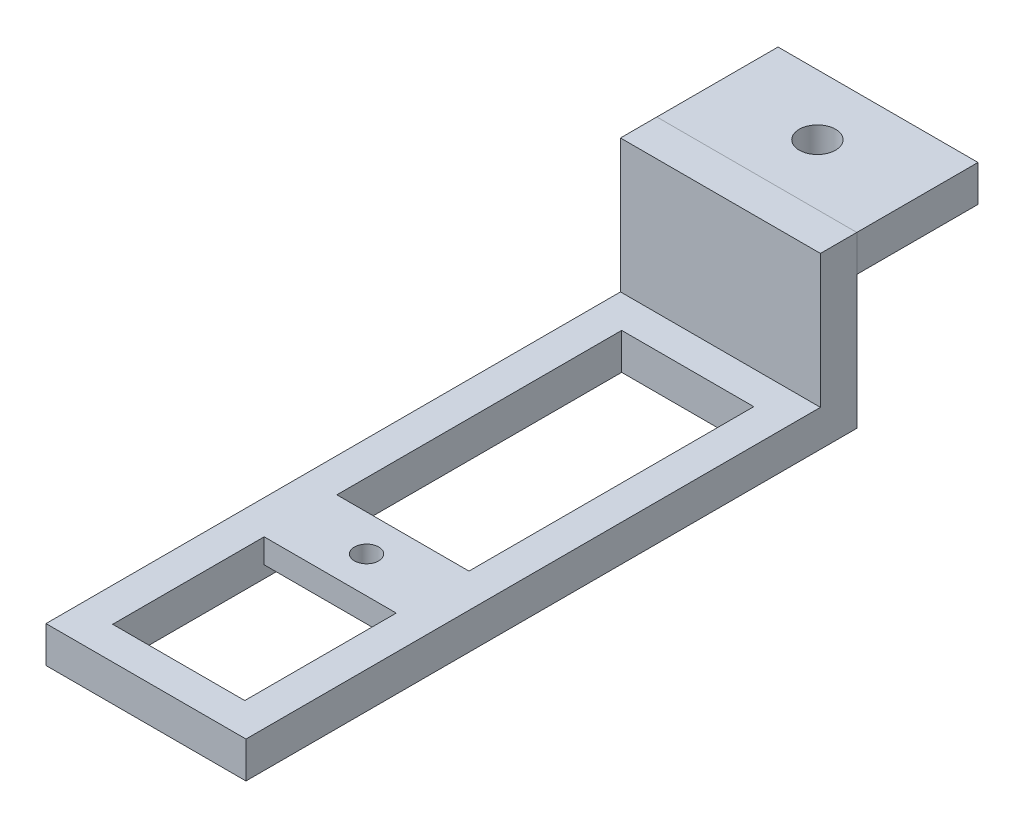
ISO-10303-21;
HEADER;
FILE_DESCRIPTION(('STEP AP214'),'2;1');
FILE_NAME('part.step','',(''),(''),'','','');
FILE_SCHEMA(('AUTOMOTIVE_DESIGN { 1 0 10303 214 1 1 1 1 }'));
ENDSEC;
DATA;
#1=APPLICATION_CONTEXT('core data for automotive mechanical design processes');
#2=APPLICATION_PROTOCOL_DEFINITION('international standard','automotive_design',2000,#1);
#3=PRODUCT_CONTEXT('',#1,'mechanical');
#4=PRODUCT('Part','Part','',(#3));
#5=PRODUCT_RELATED_PRODUCT_CATEGORY('part','',(#4));
#6=PRODUCT_DEFINITION_FORMATION('','',#4);
#7=PRODUCT_DEFINITION_CONTEXT('part definition',#1,'design');
#8=PRODUCT_DEFINITION('design','',#6,#7);
#9=PRODUCT_DEFINITION_SHAPE('','',#8);
#10=(LENGTH_UNIT() NAMED_UNIT(*) SI_UNIT(.MILLI.,.METRE.));
#11=(NAMED_UNIT(*) PLANE_ANGLE_UNIT() SI_UNIT($,.RADIAN.));
#12=(NAMED_UNIT(*) SI_UNIT($,.STERADIAN.) SOLID_ANGLE_UNIT());
#13=UNCERTAINTY_MEASURE_WITH_UNIT(LENGTH_MEASURE(1.E-05),#10,'distance_accuracy_value','');
#14=(GEOMETRIC_REPRESENTATION_CONTEXT(3) GLOBAL_UNCERTAINTY_ASSIGNED_CONTEXT((#13)) GLOBAL_UNIT_ASSIGNED_CONTEXT((#10,
#11,#12)) REPRESENTATION_CONTEXT('',''));
#15=CARTESIAN_POINT('',(0.,0.,0.));
#16=DIRECTION('',(0.,0.,1.));
#17=DIRECTION('',(1.,0.,0.));
#18=AXIS2_PLACEMENT_3D('',#15,#16,#17);
#19=CARTESIAN_POINT('',(8.49895383506108,-22.1577613516367,13.));
#20=DIRECTION('',(0.,0.,-1.));
#21=DIRECTION('',(-1.,0.,0.));
#22=AXIS2_PLACEMENT_3D('',#19,#20,#21);
#23=PLANE('',#22);
#24=DIRECTION('',(-1.,0.,0.));
#25=VECTOR('',#24,1.);
#26=CARTESIAN_POINT('',(-8.00104616493892,-19.1577613516367,13.));
#27=LINE('',#26,#25);
#28=CARTESIAN_POINT('',(8.49895383506108,-19.1577613516367,13.));
#29=VERTEX_POINT('',#28);
#30=CARTESIAN_POINT('',(-8.00104616493892,-19.1577613516367,13.));
#31=VERTEX_POINT('',#30);
#32=EDGE_CURVE('E209',#29,#31,#27,.T.);
#33=ORIENTED_EDGE('',*,*,#32,.F.);
#34=DIRECTION('',(0.,-1.,0.));
#35=VECTOR('',#34,1.);
#36=CARTESIAN_POINT('',(8.49895383506108,-22.1577613516367,13.));
#37=LINE('',#36,#35);
#38=CARTESIAN_POINT('',(8.49895383506108,-8.15776135163672,13.));
#39=VERTEX_POINT('',#38);
#40=EDGE_CURVE('E236',#39,#29,#37,.T.);
#41=ORIENTED_EDGE('',*,*,#40,.F.);
#42=DIRECTION('',(-1.,0.,0.));
#43=VECTOR('',#42,1.);
#44=CARTESIAN_POINT('',(8.49895383506108,-8.15776135163672,13.));
#45=LINE('',#44,#43);
#46=CARTESIAN_POINT('',(-8.00104616493892,-8.15776135163672,13.));
#47=VERTEX_POINT('',#46);
#48=EDGE_CURVE('E246',#39,#47,#45,.T.);
#49=ORIENTED_EDGE('',*,*,#48,.T.);
#50=DIRECTION('',(0.,-1.,0.));
#51=VECTOR('',#50,1.);
#52=CARTESIAN_POINT('',(-8.00104616493892,-22.1577613516367,13.));
#53=LINE('',#52,#51);
#54=EDGE_CURVE('E235',#47,#31,#53,.T.);
#55=ORIENTED_EDGE('',*,*,#54,.T.);
#56=EDGE_LOOP('',(#33,#41,#49,#55));
#57=FACE_BOUND('',#56,.T.);
#58=ADVANCED_FACE('F51',(#57),#23,.F.);
#59=CARTESIAN_POINT('',(8.49895383506108,-22.1577613516367,10.));
#60=DIRECTION('',(0.,1.,0.));
#61=DIRECTION('',(0.,0.,1.));
#62=AXIS2_PLACEMENT_3D('',#59,#60,#61);
#63=PLANE('',#62);
#64=DIRECTION('',(-1.,0.,0.));
#65=VECTOR('',#64,1.);
#66=CARTESIAN_POINT('',(5.69895383506108,-22.1577613516367,15.7));
#67=LINE('',#66,#65);
#68=CARTESIAN_POINT('',(5.69895383506108,-22.1577613516367,15.7));
#69=VERTEX_POINT('',#68);
#70=CARTESIAN_POINT('',(-5.20104616493892,-22.1577613516367,15.7));
#71=VERTEX_POINT('',#70);
#72=EDGE_CURVE('E197',#69,#71,#67,.T.);
#73=ORIENTED_EDGE('',*,*,#72,.T.);
#74=DIRECTION('',(0.,0.,1.));
#75=VECTOR('',#74,1.);
#76=CARTESIAN_POINT('',(-5.20104616493892,-22.1577613516367,57.7));
#77=LINE('',#76,#75);
#78=CARTESIAN_POINT('',(-5.20104616493892,-22.1577613516367,57.7));
#79=VERTEX_POINT('',#78);
#80=EDGE_CURVE('E187',#71,#79,#77,.T.);
#81=ORIENTED_EDGE('',*,*,#80,.T.);
#82=DIRECTION('',(1.,0.,0.));
#83=VECTOR('',#82,1.);
#84=CARTESIAN_POINT('',(5.69895383506108,-22.1577613516367,57.7));
#85=LINE('',#84,#83);
#86=CARTESIAN_POINT('',(5.69895383506108,-22.1577613516368,57.7));
#87=VERTEX_POINT('',#86);
#88=EDGE_CURVE('E190',#79,#87,#85,.T.);
#89=ORIENTED_EDGE('',*,*,#88,.T.);
#90=DIRECTION('',(0.,0.,-1.));
#91=VECTOR('',#90,1.);
#92=CARTESIAN_POINT('',(5.69895383506108,-22.1577613516367,57.7));
#93=LINE('',#92,#91);
#94=EDGE_CURVE('E194',#87,#69,#93,.T.);
#95=ORIENTED_EDGE('',*,*,#94,.T.);
#96=EDGE_LOOP('',(#73,#81,#89,#95));
#97=FACE_BOUND('',#96,.T.);
#98=DIRECTION('',(0.,0.,-1.));
#99=VECTOR('',#98,1.);
#100=CARTESIAN_POINT('',(-8.00104616493892,-22.1577613516367,10.));
#101=LINE('',#100,#99);
#102=CARTESIAN_POINT('',(-8.00104616493892,-22.1577613516367,60.4));
#103=VERTEX_POINT('',#102);
#104=CARTESIAN_POINT('',(-8.00104616493892,-22.1577613516367,10.));
#105=VERTEX_POINT('',#104);
#106=EDGE_CURVE('E248',#103,#105,#101,.T.);
#107=ORIENTED_EDGE('',*,*,#106,.T.);
#108=DIRECTION('',(-1.,0.,0.));
#109=VECTOR('',#108,1.);
#110=CARTESIAN_POINT('',(8.49895383506108,-22.1577613516367,10.));
#111=LINE('',#110,#109);
#112=CARTESIAN_POINT('',(8.49895383506108,-22.1577613516367,10.));
#113=VERTEX_POINT('',#112);
#114=EDGE_CURVE('E12',#113,#105,#111,.T.);
#115=ORIENTED_EDGE('',*,*,#114,.F.);
#116=DIRECTION('',(0.,0.,-1.));
#117=VECTOR('',#116,1.);
#118=CARTESIAN_POINT('',(8.49895383506108,-22.1577613516367,10.));
#119=LINE('',#118,#117);
#120=CARTESIAN_POINT('',(8.49895383506108,-22.1577613516367,60.4));
#121=VERTEX_POINT('',#120);
#122=EDGE_CURVE('E239',#121,#113,#119,.T.);
#123=ORIENTED_EDGE('',*,*,#122,.F.);
#124=DIRECTION('',(1.,0.,0.));
#125=VECTOR('',#124,1.);
#126=CARTESIAN_POINT('',(-8.00104616493892,-22.1577613516367,60.4));
#127=LINE('',#126,#125);
#128=EDGE_CURVE('E224',#103,#121,#127,.T.);
#129=ORIENTED_EDGE('',*,*,#128,.F.);
#130=EDGE_LOOP('',(#107,#115,#123,#129));
#131=FACE_BOUND('',#130,.T.);
#132=ADVANCED_FACE('F280',(#97,#131),#63,.F.);
#133=CARTESIAN_POINT('',(8.49895383506108,-22.1577613516367,10.));
#134=DIRECTION('',(0.,0.,1.));
#135=DIRECTION('',(1.,0.,0.));
#136=AXIS2_PLACEMENT_3D('',#133,#134,#135);
#137=PLANE('',#136);
#138=DIRECTION('',(0.,1.,0.));
#139=VECTOR('',#138,1.);
#140=CARTESIAN_POINT('',(-8.00104616493892,-22.1577613516367,10.));
#141=LINE('',#140,#139);
#142=CARTESIAN_POINT('',(-8.00104616493892,-8.15776135163671,10.));
#143=VERTEX_POINT('',#142);
#144=EDGE_CURVE('E250',#105,#143,#141,.T.);
#145=ORIENTED_EDGE('',*,*,#144,.T.);
#146=DIRECTION('',(-1.,0.,0.));
#147=VECTOR('',#146,1.);
#148=CARTESIAN_POINT('',(8.49895383506108,-8.15776135163671,10.));
#149=LINE('',#148,#147);
#150=CARTESIAN_POINT('',(8.49895383506108,-8.15776135163671,10.));
#151=VERTEX_POINT('',#150);
#152=EDGE_CURVE('E58',#151,#143,#149,.T.);
#153=ORIENTED_EDGE('',*,*,#152,.F.);
#154=DIRECTION('',(0.,1.,0.));
#155=VECTOR('',#154,1.);
#156=CARTESIAN_POINT('',(8.49895383506108,-22.1577613516367,10.));
#157=LINE('',#156,#155);
#158=EDGE_CURVE('E242',#113,#151,#157,.T.);
#159=ORIENTED_EDGE('',*,*,#158,.F.);
#160=ORIENTED_EDGE('',*,*,#114,.T.);
#161=EDGE_LOOP('',(#145,#153,#159,#160));
#162=FACE_BOUND('',#161,.T.);
#163=ADVANCED_FACE('F278',(#162),#137,.F.);
#164=CARTESIAN_POINT('',(8.49895383506108,-8.15776135163671,10.));
#165=DIRECTION('',(0.,-1.,0.));
#166=DIRECTION('',(0.,0.,-1.));
#167=AXIS2_PLACEMENT_3D('',#164,#165,#166);
#168=PLANE('',#167);
#169=DIRECTION('',(0.,0.,1.));
#170=VECTOR('',#169,1.);
#171=CARTESIAN_POINT('',(-8.00104616493892,-8.15776135163671,10.));
#172=LINE('',#171,#170);
#173=EDGE_CURVE('E240',#143,#47,#172,.T.);
#174=ORIENTED_EDGE('',*,*,#173,.T.);
#175=ORIENTED_EDGE('',*,*,#48,.F.);
#176=DIRECTION('',(0.,0.,1.));
#177=VECTOR('',#176,1.);
#178=CARTESIAN_POINT('',(8.49895383506108,-8.15776135163671,10.));
#179=LINE('',#178,#177);
#180=EDGE_CURVE('E244',#151,#39,#179,.T.);
#181=ORIENTED_EDGE('',*,*,#180,.F.);
#182=ORIENTED_EDGE('',*,*,#152,.T.);
#183=EDGE_LOOP('',(#174,#175,#181,#182));
#184=FACE_BOUND('',#183,.T.);
#185=ADVANCED_FACE('F259',(#184),#168,.F.);
#186=CARTESIAN_POINT('',(8.49895383506108,0.,0.));
#187=DIRECTION('',(1.,0.,0.));
#188=DIRECTION('',(0.,0.,-1.));
#189=AXIS2_PLACEMENT_3D('',#186,#187,#188);
#190=PLANE('',#189);
#191=ORIENTED_EDGE('',*,*,#40,.T.);
#192=DIRECTION('',(0.,0.,-1.));
#193=VECTOR('',#192,1.);
#194=CARTESIAN_POINT('',(8.49895383506108,-19.1577613516367,60.4));
#195=LINE('',#194,#193);
#196=CARTESIAN_POINT('',(8.49895383506108,-19.1577613516367,60.4));
#197=VERTEX_POINT('',#196);
#198=EDGE_CURVE('E232',#197,#29,#195,.T.);
#199=ORIENTED_EDGE('',*,*,#198,.F.);
#200=DIRECTION('',(0.,1.,0.));
#201=VECTOR('',#200,1.);
#202=CARTESIAN_POINT('',(8.49895383506108,-19.1577613516367,60.4));
#203=LINE('',#202,#201);
#204=EDGE_CURVE('E216',#121,#197,#203,.T.);
#205=ORIENTED_EDGE('',*,*,#204,.F.);
#206=ORIENTED_EDGE('',*,*,#122,.T.);
#207=ORIENTED_EDGE('',*,*,#158,.T.);
#208=ORIENTED_EDGE('',*,*,#180,.T.);
#209=EDGE_LOOP('',(#191,#199,#205,#206,#207,#208));
#210=FACE_BOUND('',#209,.T.);
#211=ADVANCED_FACE('F276',(#210),#190,.T.);
#212=CARTESIAN_POINT('',(-8.00104616493892,0.,0.));
#213=DIRECTION('',(1.,0.,0.));
#214=DIRECTION('',(0.,0.,-1.));
#215=AXIS2_PLACEMENT_3D('',#212,#213,#214);
#216=PLANE('',#215);
#217=ORIENTED_EDGE('',*,*,#54,.F.);
#218=ORIENTED_EDGE('',*,*,#173,.F.);
#219=ORIENTED_EDGE('',*,*,#144,.F.);
#220=ORIENTED_EDGE('',*,*,#106,.F.);
#221=DIRECTION('',(0.,-1.,0.));
#222=VECTOR('',#221,1.);
#223=CARTESIAN_POINT('',(-8.00104616493892,-19.1577613516367,60.4));
#224=LINE('',#223,#222);
#225=CARTESIAN_POINT('',(-8.00104616493892,-19.1577613516367,60.4));
#226=VERTEX_POINT('',#225);
#227=EDGE_CURVE('E221',#226,#103,#224,.T.);
#228=ORIENTED_EDGE('',*,*,#227,.F.);
#229=DIRECTION('',(0.,0.,-1.));
#230=VECTOR('',#229,1.);
#231=CARTESIAN_POINT('',(-8.00104616493892,-19.1577613516367,60.4));
#232=LINE('',#231,#230);
#233=EDGE_CURVE('E227',#226,#31,#232,.T.);
#234=ORIENTED_EDGE('',*,*,#233,.T.);
#235=EDGE_LOOP('',(#217,#218,#219,#220,#228,#234));
#236=FACE_BOUND('',#235,.T.);
#237=ADVANCED_FACE('F266',(#236),#216,.F.);
#238=CARTESIAN_POINT('',(-8.00104616493892,-19.1577613516367,60.4));
#239=DIRECTION('',(0.,-1.,0.));
#240=DIRECTION('',(0.,0.,-1.));
#241=AXIS2_PLACEMENT_3D('',#238,#239,#240);
#242=PLANE('',#241);
#243=DIRECTION('',(0.,0.,1.));
#244=VECTOR('',#243,1.);
#245=CARTESIAN_POINT('',(-5.20104616493892,-19.1577613516367,57.7));
#246=LINE('',#245,#244);
#247=CARTESIAN_POINT('',(-5.20104616493892,-19.1577613516367,45.2));
#248=VERTEX_POINT('',#247);
#249=CARTESIAN_POINT('',(-5.20104616493892,-19.1577613516367,57.7));
#250=VERTEX_POINT('',#249);
#251=EDGE_CURVE('E150',#248,#250,#246,.T.);
#252=ORIENTED_EDGE('',*,*,#251,.F.);
#253=DIRECTION('',(1.,0.,0.));
#254=VECTOR('',#253,1.);
#255=CARTESIAN_POINT('',(5.69895383506108,-19.1577613516367,45.2));
#256=LINE('',#255,#254);
#257=CARTESIAN_POINT('',(5.69895383506108,-19.1577613516367,45.2));
#258=VERTEX_POINT('',#257);
#259=EDGE_CURVE('E155',#248,#258,#256,.T.);
#260=ORIENTED_EDGE('',*,*,#259,.T.);
#261=DIRECTION('',(0.,0.,-1.));
#262=VECTOR('',#261,1.);
#263=CARTESIAN_POINT('',(5.69895383506108,-19.1577613516367,57.7));
#264=LINE('',#263,#262);
#265=CARTESIAN_POINT('',(5.69895383506108,-19.1577613516367,57.7));
#266=VERTEX_POINT('',#265);
#267=EDGE_CURVE('E203',#266,#258,#264,.T.);
#268=ORIENTED_EDGE('',*,*,#267,.F.);
#269=DIRECTION('',(1.,0.,0.));
#270=VECTOR('',#269,1.);
#271=CARTESIAN_POINT('',(5.69895383506108,-19.1577613516367,57.7));
#272=LINE('',#271,#270);
#273=EDGE_CURVE('E157',#250,#266,#272,.T.);
#274=ORIENTED_EDGE('',*,*,#273,.F.);
#275=EDGE_LOOP('',(#252,#260,#268,#274));
#276=FACE_BOUND('',#275,.T.);
#277=DIRECTION('',(-1.,0.,0.));
#278=VECTOR('',#277,1.);
#279=CARTESIAN_POINT('',(5.69895383506108,-19.1577613516367,39.2));
#280=LINE('',#279,#278);
#281=CARTESIAN_POINT('',(5.69895383506108,-19.1577613516367,39.2));
#282=VERTEX_POINT('',#281);
#283=CARTESIAN_POINT('',(-5.20104616493892,-19.1577613516367,39.2));
#284=VERTEX_POINT('',#283);
#285=EDGE_CURVE('E171',#282,#284,#280,.T.);
#286=ORIENTED_EDGE('',*,*,#285,.T.);
#287=CARTESIAN_POINT('',(-5.20104616493892,-19.1577613516367,15.7));
#288=VERTEX_POINT('',#287);
#289=EDGE_CURVE('E159',#288,#284,#246,.T.);
#290=ORIENTED_EDGE('',*,*,#289,.F.);
#291=DIRECTION('',(-1.,0.,0.));
#292=VECTOR('',#291,1.);
#293=CARTESIAN_POINT('',(5.69895383506108,-19.1577613516367,15.7));
#294=LINE('',#293,#292);
#295=CARTESIAN_POINT('',(5.69895383506108,-19.1577613516367,15.7));
#296=VERTEX_POINT('',#295);
#297=EDGE_CURVE('E191',#296,#288,#294,.T.);
#298=ORIENTED_EDGE('',*,*,#297,.F.);
#299=EDGE_CURVE('E202',#282,#296,#264,.T.);
#300=ORIENTED_EDGE('',*,*,#299,.F.);
#301=EDGE_LOOP('',(#286,#290,#298,#300));
#302=FACE_BOUND('',#301,.T.);
#303=ORIENTED_EDGE('',*,*,#32,.T.);
#304=ORIENTED_EDGE('',*,*,#233,.F.);
#305=DIRECTION('',(-1.,0.,0.));
#306=VECTOR('',#305,1.);
#307=CARTESIAN_POINT('',(-8.00104616493892,-19.1577613516367,60.4));
#308=LINE('',#307,#306);
#309=EDGE_CURVE('E219',#197,#226,#308,.T.);
#310=ORIENTED_EDGE('',*,*,#309,.F.);
#311=ORIENTED_EDGE('',*,*,#198,.T.);
#312=EDGE_LOOP('',(#303,#304,#310,#311));
#313=FACE_BOUND('',#312,.T.);
#314=CARTESIAN_POINT('',(0.248953835061079,-19.1577613516367,42.2));
#315=DIRECTION('',(0.,1.,0.));
#316=DIRECTION('',(0.,0.,1.));
#317=AXIS2_PLACEMENT_3D('',#314,#315,#316);
#318=CIRCLE('',#317,1.);
#319=CARTESIAN_POINT('',(0.248953835061079,-19.1577613516367,43.2));
#320=VERTEX_POINT('',#319);
#321=EDGE_CURVE('E177',#320,#320,#318,.T.);
#322=ORIENTED_EDGE('',*,*,#321,.F.);
#323=EDGE_LOOP('',(#322));
#324=FACE_BOUND('',#323,.T.);
#325=ADVANCED_FACE('F151',(#276,#302,#313,#324),#242,.F.);
#326=CARTESIAN_POINT('',(0.,0.,60.4));
#327=DIRECTION('',(0.,0.,1.));
#328=DIRECTION('',(1.,0.,0.));
#329=AXIS2_PLACEMENT_3D('',#326,#327,#328);
#330=PLANE('',#329);
#331=ORIENTED_EDGE('',*,*,#204,.T.);
#332=ORIENTED_EDGE('',*,*,#309,.T.);
#333=ORIENTED_EDGE('',*,*,#227,.T.);
#334=ORIENTED_EDGE('',*,*,#128,.T.);
#335=EDGE_LOOP('',(#331,#332,#333,#334));
#336=FACE_BOUND('',#335,.T.);
#337=ADVANCED_FACE('F283',(#336),#330,.T.);
#338=CARTESIAN_POINT('',(-5.20104616493892,-22.1577613516367,57.7));
#339=DIRECTION('',(-1.,0.,0.));
#340=DIRECTION('',(0.,0.,1.));
#341=AXIS2_PLACEMENT_3D('',#338,#339,#340);
#342=PLANE('',#341);
#343=ORIENTED_EDGE('',*,*,#289,.T.);
#344=DIRECTION('',(0.,1.,0.));
#345=VECTOR('',#344,1.);
#346=CARTESIAN_POINT('',(-5.20104616493892,-21.1577613516367,39.2));
#347=LINE('',#346,#345);
#348=CARTESIAN_POINT('',(-5.20104616493892,-21.1577613516367,39.2));
#349=VERTEX_POINT('',#348);
#350=EDGE_CURVE('E65',#349,#284,#347,.T.);
#351=ORIENTED_EDGE('',*,*,#350,.F.);
#352=DIRECTION('',(0.,0.,1.));
#353=VECTOR('',#352,1.);
#354=CARTESIAN_POINT('',(-5.20104616493892,-21.1577613516367,45.2));
#355=LINE('',#354,#353);
#356=CARTESIAN_POINT('',(-5.20104616493892,-21.1577613516367,45.2));
#357=VERTEX_POINT('',#356);
#358=EDGE_CURVE('E69',#349,#357,#355,.T.);
#359=ORIENTED_EDGE('',*,*,#358,.T.);
#360=DIRECTION('',(0.,1.,0.));
#361=VECTOR('',#360,1.);
#362=CARTESIAN_POINT('',(-5.20104616493892,-21.1577613516367,45.2));
#363=LINE('',#362,#361);
#364=EDGE_CURVE('E161',#357,#248,#363,.T.);
#365=ORIENTED_EDGE('',*,*,#364,.T.);
#366=ORIENTED_EDGE('',*,*,#251,.T.);
#367=DIRECTION('',(0.,1.,0.));
#368=VECTOR('',#367,1.);
#369=CARTESIAN_POINT('',(-5.20104616493892,-22.1577613516367,57.7));
#370=LINE('',#369,#368);
#371=EDGE_CURVE('E199',#79,#250,#370,.T.);
#372=ORIENTED_EDGE('',*,*,#371,.F.);
#373=ORIENTED_EDGE('',*,*,#80,.F.);
#374=DIRECTION('',(0.,1.,0.));
#375=VECTOR('',#374,1.);
#376=CARTESIAN_POINT('',(-5.20104616493892,-22.1577613516367,15.7));
#377=LINE('',#376,#375);
#378=EDGE_CURVE('E207',#71,#288,#377,.T.);
#379=ORIENTED_EDGE('',*,*,#378,.T.);
#380=EDGE_LOOP('',(#343,#351,#359,#365,#366,#372,#373,#379));
#381=FACE_BOUND('',#380,.T.);
#382=ADVANCED_FACE('F162',(#381),#342,.F.);
#383=CARTESIAN_POINT('',(5.69895383506108,-22.1577613516367,15.7));
#384=DIRECTION('',(0.,0.,-1.));
#385=DIRECTION('',(-1.,0.,0.));
#386=AXIS2_PLACEMENT_3D('',#383,#384,#385);
#387=PLANE('',#386);
#388=ORIENTED_EDGE('',*,*,#297,.T.);
#389=ORIENTED_EDGE('',*,*,#378,.F.);
#390=ORIENTED_EDGE('',*,*,#72,.F.);
#391=DIRECTION('',(0.,1.,0.));
#392=VECTOR('',#391,1.);
#393=CARTESIAN_POINT('',(5.69895383506108,-22.1577613516367,15.7));
#394=LINE('',#393,#392);
#395=EDGE_CURVE('E210',#69,#296,#394,.T.);
#396=ORIENTED_EDGE('',*,*,#395,.T.);
#397=EDGE_LOOP('',(#388,#389,#390,#396));
#398=FACE_BOUND('',#397,.T.);
#399=ADVANCED_FACE('F291',(#398),#387,.F.);
#400=CARTESIAN_POINT('',(5.69895383506108,-22.1577613516367,57.7));
#401=DIRECTION('',(1.,0.,0.));
#402=DIRECTION('',(0.,0.,-1.));
#403=AXIS2_PLACEMENT_3D('',#400,#401,#402);
#404=PLANE('',#403);
#405=DIRECTION('',(0.,0.,-1.));
#406=VECTOR('',#405,1.);
#407=CARTESIAN_POINT('',(5.69895383506108,-21.1577613516367,45.2));
#408=LINE('',#407,#406);
#409=CARTESIAN_POINT('',(5.69895383506108,-21.1577613516367,45.2));
#410=VERTEX_POINT('',#409);
#411=CARTESIAN_POINT('',(5.69895383506108,-21.1577613516367,39.2));
#412=VERTEX_POINT('',#411);
#413=EDGE_CURVE('E416',#410,#412,#408,.T.);
#414=ORIENTED_EDGE('',*,*,#413,.T.);
#415=DIRECTION('',(0.,1.,0.));
#416=VECTOR('',#415,1.);
#417=CARTESIAN_POINT('',(5.69895383506108,-21.1577613516367,39.2));
#418=LINE('',#417,#416);
#419=EDGE_CURVE('E183',#412,#282,#418,.T.);
#420=ORIENTED_EDGE('',*,*,#419,.T.);
#421=ORIENTED_EDGE('',*,*,#299,.T.);
#422=ORIENTED_EDGE('',*,*,#395,.F.);
#423=ORIENTED_EDGE('',*,*,#94,.F.);
#424=DIRECTION('',(0.,1.,0.));
#425=VECTOR('',#424,1.);
#426=CARTESIAN_POINT('',(5.69895383506108,-22.1577613516367,57.7));
#427=LINE('',#426,#425);
#428=EDGE_CURVE('E213',#87,#266,#427,.T.);
#429=ORIENTED_EDGE('',*,*,#428,.T.);
#430=ORIENTED_EDGE('',*,*,#267,.T.);
#431=DIRECTION('',(0.,1.,0.));
#432=VECTOR('',#431,1.);
#433=CARTESIAN_POINT('',(5.69895383506108,-21.1577613516367,45.2));
#434=LINE('',#433,#432);
#435=EDGE_CURVE('E166',#410,#258,#434,.T.);
#436=ORIENTED_EDGE('',*,*,#435,.F.);
#437=EDGE_LOOP('',(#414,#420,#421,#422,#423,#429,#430,#436));
#438=FACE_BOUND('',#437,.T.);
#439=ADVANCED_FACE('F349',(#438),#404,.F.);
#440=CARTESIAN_POINT('',(5.69895383506108,-22.1577613516367,57.7));
#441=DIRECTION('',(0.,0.,1.));
#442=DIRECTION('',(1.,0.,0.));
#443=AXIS2_PLACEMENT_3D('',#440,#441,#442);
#444=PLANE('',#443);
#445=ORIENTED_EDGE('',*,*,#273,.T.);
#446=ORIENTED_EDGE('',*,*,#428,.F.);
#447=ORIENTED_EDGE('',*,*,#88,.F.);
#448=ORIENTED_EDGE('',*,*,#371,.T.);
#449=EDGE_LOOP('',(#445,#446,#447,#448));
#450=FACE_BOUND('',#449,.T.);
#451=ADVANCED_FACE('F358',(#450),#444,.F.);
#452=CARTESIAN_POINT('',(5.69895383506108,-21.1577613516367,39.2));
#453=DIRECTION('',(0.,0.,-1.));
#454=DIRECTION('',(-1.,0.,0.));
#455=AXIS2_PLACEMENT_3D('',#452,#453,#454);
#456=PLANE('',#455);
#457=ORIENTED_EDGE('',*,*,#285,.F.);
#458=ORIENTED_EDGE('',*,*,#419,.F.);
#459=DIRECTION('',(-1.,0.,0.));
#460=VECTOR('',#459,1.);
#461=CARTESIAN_POINT('',(5.69895383506108,-21.1577613516367,39.2));
#462=LINE('',#461,#460);
#463=EDGE_CURVE('E167',#412,#349,#462,.T.);
#464=ORIENTED_EDGE('',*,*,#463,.T.);
#465=ORIENTED_EDGE('',*,*,#350,.T.);
#466=EDGE_LOOP('',(#457,#458,#464,#465));
#467=FACE_BOUND('',#466,.T.);
#468=ADVANCED_FACE('F367',(#467),#456,.T.);
#469=CARTESIAN_POINT('',(5.69895383506108,-21.1577613516367,45.2));
#470=DIRECTION('',(0.,0.,1.));
#471=DIRECTION('',(1.,0.,0.));
#472=AXIS2_PLACEMENT_3D('',#469,#470,#471);
#473=PLANE('',#472);
#474=ORIENTED_EDGE('',*,*,#259,.F.);
#475=ORIENTED_EDGE('',*,*,#364,.F.);
#476=DIRECTION('',(1.,0.,0.));
#477=VECTOR('',#476,1.);
#478=CARTESIAN_POINT('',(5.69895383506108,-21.1577613516367,45.2));
#479=LINE('',#478,#477);
#480=EDGE_CURVE('E415',#357,#410,#479,.T.);
#481=ORIENTED_EDGE('',*,*,#480,.T.);
#482=ORIENTED_EDGE('',*,*,#435,.T.);
#483=EDGE_LOOP('',(#474,#475,#481,#482));
#484=FACE_BOUND('',#483,.T.);
#485=ADVANCED_FACE('F170',(#484),#473,.T.);
#486=CARTESIAN_POINT('',(0.,-21.1577613516367,0.));
#487=DIRECTION('',(0.,1.,0.));
#488=DIRECTION('',(0.,0.,1.));
#489=AXIS2_PLACEMENT_3D('',#486,#487,#488);
#490=PLANE('',#489);
#491=CARTESIAN_POINT('',(0.248953835061079,-21.1577613516367,42.2));
#492=DIRECTION('',(0.,1.,0.));
#493=DIRECTION('',(0.,0.,1.));
#494=AXIS2_PLACEMENT_3D('',#491,#492,#493);
#495=CIRCLE('',#494,1.);
#496=CARTESIAN_POINT('',(0.248953835061079,-21.1577613516367,43.2));
#497=VERTEX_POINT('',#496);
#498=EDGE_CURVE('E172',#497,#497,#495,.T.);
#499=ORIENTED_EDGE('',*,*,#498,.T.);
#500=EDGE_LOOP('',(#499));
#501=FACE_BOUND('',#500,.T.);
#502=ORIENTED_EDGE('',*,*,#358,.F.);
#503=ORIENTED_EDGE('',*,*,#463,.F.);
#504=ORIENTED_EDGE('',*,*,#413,.F.);
#505=ORIENTED_EDGE('',*,*,#480,.F.);
#506=EDGE_LOOP('',(#502,#503,#504,#505));
#507=FACE_BOUND('',#506,.T.);
#508=ADVANCED_FACE('F384',(#501,#507),#490,.F.);
#509=CARTESIAN_POINT('',(0.248953835061079,-21.1577613516367,42.2));
#510=DIRECTION('',(0.,1.,0.));
#511=DIRECTION('',(0.,0.,1.));
#512=AXIS2_PLACEMENT_3D('',#509,#510,#511);
#513=CYLINDRICAL_SURFACE('',#512,1.);
#514=ORIENTED_EDGE('',*,*,#498,.F.);
#515=EDGE_LOOP('',(#514));
#516=FACE_BOUND('',#515,.T.);
#517=ORIENTED_EDGE('',*,*,#321,.T.);
#518=EDGE_LOOP('',(#517));
#519=FACE_BOUND('',#518,.T.);
#520=ADVANCED_FACE('F392',(#516,#519),#513,.F.);
#521=CLOSED_SHELL('',(#58,#132,#163,#185,#211,#237,#325,#337,#382,#399,#439,#451,#468,#485,#508,#520));
#522=MANIFOLD_SOLID_BREP('B2',#521);
#523=CARTESIAN_POINT('',(-8.00104616493892,-28.6577613516367,15.1627971778015));
#524=DIRECTION('',(1.,0.,0.));
#525=DIRECTION('',(0.,1.,0.));
#526=AXIS2_PLACEMENT_3D('',#523,#524,#525);
#527=PLANE('',#526);
#528=DIRECTION('',(0.,1.,0.));
#529=VECTOR('',#528,1.);
#530=CARTESIAN_POINT('',(-8.00104616493892,0.,10.));
#531=LINE('',#530,#529);
#532=CARTESIAN_POINT('',(-8.00104616493892,-11.1577613516367,10.));
#533=VERTEX_POINT('',#532);
#534=CARTESIAN_POINT('',(-8.00104616493892,-8.15776135163673,10.));
#535=VERTEX_POINT('',#534);
#536=EDGE_CURVE('E518',#533,#535,#531,.T.);
#537=ORIENTED_EDGE('',*,*,#536,.T.);
#538=DIRECTION('',(0.,0.,1.));
#539=VECTOR('',#538,1.);
#540=CARTESIAN_POINT('',(-8.00104616493892,-8.15776135163673,10.));
#541=LINE('',#540,#539);
#542=CARTESIAN_POINT('',(-8.00104616493892,-8.15776135163673,0.));
#543=VERTEX_POINT('',#542);
#544=EDGE_CURVE('E531',#543,#535,#541,.T.);
#545=ORIENTED_EDGE('',*,*,#544,.F.);
#546=DIRECTION('',(0.,1.,0.));
#547=VECTOR('',#546,1.);
#548=CARTESIAN_POINT('',(-8.00104616493892,0.,0.));
#549=LINE('',#548,#547);
#550=CARTESIAN_POINT('',(-8.00104616493892,-11.1577613516367,0.));
#551=VERTEX_POINT('',#550);
#552=EDGE_CURVE('E467',#551,#543,#549,.T.);
#553=ORIENTED_EDGE('',*,*,#552,.F.);
#554=DIRECTION('',(0.,0.,-1.));
#555=VECTOR('',#554,1.);
#556=CARTESIAN_POINT('',(-8.00104616493892,-11.1577613516367,10.));
#557=LINE('',#556,#555);
#558=EDGE_CURVE('E530',#533,#551,#557,.T.);
#559=ORIENTED_EDGE('',*,*,#558,.F.);
#560=EDGE_LOOP('',(#537,#545,#553,#559));
#561=FACE_BOUND('',#560,.T.);
#562=ADVANCED_FACE('F459',(#561),#527,.F.);
#563=CARTESIAN_POINT('',(0.,0.,10.));
#564=DIRECTION('',(0.,0.,1.));
#565=DIRECTION('',(1.,0.,0.));
#566=AXIS2_PLACEMENT_3D('',#563,#564,#565);
#567=PLANE('',#566);
#568=DIRECTION('',(0.,1.,0.));
#569=VECTOR('',#568,1.);
#570=CARTESIAN_POINT('',(8.49895383506109,-28.6577613516367,10.));
#571=LINE('',#570,#569);
#572=CARTESIAN_POINT('',(8.49895383506108,-11.1577613516367,10.));
#573=VERTEX_POINT('',#572);
#574=CARTESIAN_POINT('',(8.49895383506108,-8.15776135163672,10.));
#575=VERTEX_POINT('',#574);
#576=EDGE_CURVE('E499',#573,#575,#571,.T.);
#577=ORIENTED_EDGE('',*,*,#576,.T.);
#578=DIRECTION('',(-1.,0.,0.));
#579=VECTOR('',#578,1.);
#580=CARTESIAN_POINT('',(98.6393724543672,-8.15776135163671,10.));
#581=LINE('',#580,#579);
#582=EDGE_CURVE('E519',#575,#535,#581,.T.);
#583=ORIENTED_EDGE('',*,*,#582,.T.);
#584=ORIENTED_EDGE('',*,*,#536,.F.);
#585=DIRECTION('',(1.,0.,0.));
#586=VECTOR('',#585,1.);
#587=CARTESIAN_POINT('',(98.6393724543672,-11.1577613516367,10.));
#588=LINE('',#587,#586);
#589=EDGE_CURVE('E511',#533,#573,#588,.T.);
#590=ORIENTED_EDGE('',*,*,#589,.T.);
#591=EDGE_LOOP('',(#577,#583,#584,#590));
#592=FACE_BOUND('',#591,.T.);
#593=ADVANCED_FACE('F516',(#592),#567,.T.);
#594=CARTESIAN_POINT('',(0.,0.,0.));
#595=DIRECTION('',(0.,0.,1.));
#596=DIRECTION('',(1.,0.,0.));
#597=AXIS2_PLACEMENT_3D('',#594,#595,#596);
#598=PLANE('',#597);
#599=DIRECTION('',(-1.,0.,0.));
#600=VECTOR('',#599,1.);
#601=CARTESIAN_POINT('',(98.6393724543672,-8.15776135163671,0.));
#602=LINE('',#601,#600);
#603=CARTESIAN_POINT('',(8.49895383506108,-8.15776135163672,0.));
#604=VERTEX_POINT('',#603);
#605=EDGE_CURVE('E481',#604,#543,#602,.T.);
#606=ORIENTED_EDGE('',*,*,#605,.F.);
#607=DIRECTION('',(0.,-1.,0.));
#608=VECTOR('',#607,1.);
#609=CARTESIAN_POINT('',(8.49895383506108,0.,0.));
#610=LINE('',#609,#608);
#611=CARTESIAN_POINT('',(8.49895383506108,-11.1577613516367,0.));
#612=VERTEX_POINT('',#611);
#613=EDGE_CURVE('E49',#604,#612,#610,.T.);
#614=ORIENTED_EDGE('',*,*,#613,.T.);
#615=DIRECTION('',(1.,0.,0.));
#616=VECTOR('',#615,1.);
#617=CARTESIAN_POINT('',(98.6393724543672,-11.1577613516367,0.));
#618=LINE('',#617,#616);
#619=EDGE_CURVE('E513',#551,#612,#618,.T.);
#620=ORIENTED_EDGE('',*,*,#619,.F.);
#621=ORIENTED_EDGE('',*,*,#552,.T.);
#622=EDGE_LOOP('',(#606,#614,#620,#621));
#623=FACE_BOUND('',#622,.T.);
#624=ADVANCED_FACE('F528',(#623),#598,.F.);
#625=CARTESIAN_POINT('',(98.6393724543672,-11.1577613516367,10.));
#626=DIRECTION('',(0.,1.,0.));
#627=DIRECTION('',(-1.,0.,0.));
#628=AXIS2_PLACEMENT_3D('',#625,#626,#627);
#629=PLANE('',#628);
#630=CARTESIAN_POINT('',(0.248953835061079,-11.1577613516367,5.));
#631=DIRECTION('',(0.,1.,0.));
#632=DIRECTION('',(-1.,0.,0.));
#633=AXIS2_PLACEMENT_3D('',#630,#631,#632);
#634=CIRCLE('',#633,1.5);
#635=CARTESIAN_POINT('',(-1.25104616493892,-11.1577613516367,5.));
#636=VERTEX_POINT('',#635);
#637=EDGE_CURVE('E505',#636,#636,#634,.T.);
#638=ORIENTED_EDGE('',*,*,#637,.T.);
#639=EDGE_LOOP('',(#638));
#640=FACE_BOUND('',#639,.T.);
#641=ORIENTED_EDGE('',*,*,#619,.T.);
#642=DIRECTION('',(0.,0.,1.));
#643=VECTOR('',#642,1.);
#644=CARTESIAN_POINT('',(8.49895383506108,-11.1577613516367,10.));
#645=LINE('',#644,#643);
#646=EDGE_CURVE('E474',#612,#573,#645,.T.);
#647=ORIENTED_EDGE('',*,*,#646,.T.);
#648=ORIENTED_EDGE('',*,*,#589,.F.);
#649=ORIENTED_EDGE('',*,*,#558,.T.);
#650=EDGE_LOOP('',(#641,#647,#648,#649));
#651=FACE_BOUND('',#650,.T.);
#652=ADVANCED_FACE('F461',(#640,#651),#629,.F.);
#653=CARTESIAN_POINT('',(98.6393724543672,-8.15776135163671,10.));
#654=DIRECTION('',(0.,-1.,0.));
#655=DIRECTION('',(1.,0.,0.));
#656=AXIS2_PLACEMENT_3D('',#653,#654,#655);
#657=PLANE('',#656);
#658=CARTESIAN_POINT('',(0.248953835061078,-8.15776135163673,5.));
#659=DIRECTION('',(0.,1.,0.));
#660=DIRECTION('',(-1.,0.,0.));
#661=AXIS2_PLACEMENT_3D('',#658,#659,#660);
#662=CIRCLE('',#661,1.5);
#663=CARTESIAN_POINT('',(-1.25104616493892,-8.15776135163673,5.));
#664=VERTEX_POINT('',#663);
#665=EDGE_CURVE('E537',#664,#664,#662,.T.);
#666=ORIENTED_EDGE('',*,*,#665,.F.);
#667=EDGE_LOOP('',(#666));
#668=FACE_BOUND('',#667,.T.);
#669=ORIENTED_EDGE('',*,*,#582,.F.);
#670=DIRECTION('',(0.,0.,-1.));
#671=VECTOR('',#670,1.);
#672=CARTESIAN_POINT('',(8.49895383506108,-8.15776135163673,10.));
#673=LINE('',#672,#671);
#674=EDGE_CURVE('E501',#575,#604,#673,.T.);
#675=ORIENTED_EDGE('',*,*,#674,.T.);
#676=ORIENTED_EDGE('',*,*,#605,.T.);
#677=ORIENTED_EDGE('',*,*,#544,.T.);
#678=EDGE_LOOP('',(#669,#675,#676,#677));
#679=FACE_BOUND('',#678,.T.);
#680=ADVANCED_FACE('F544',(#668,#679),#657,.F.);
#681=CARTESIAN_POINT('',(8.49895383506108,-28.6577613516367,-9.96592661161064));
#682=DIRECTION('',(-1.,0.,0.));
#683=DIRECTION('',(0.,-1.,0.));
#684=AXIS2_PLACEMENT_3D('',#681,#682,#683);
#685=PLANE('',#684);
#686=ORIENTED_EDGE('',*,*,#576,.F.);
#687=ORIENTED_EDGE('',*,*,#646,.F.);
#688=ORIENTED_EDGE('',*,*,#613,.F.);
#689=ORIENTED_EDGE('',*,*,#674,.F.);
#690=EDGE_LOOP('',(#686,#687,#688,#689));
#691=FACE_BOUND('',#690,.T.);
#692=ADVANCED_FACE('F500',(#691),#685,.F.);
#693=CARTESIAN_POINT('',(0.24895383506108,-18.1577613516367,5.));
#694=DIRECTION('',(0.,1.,0.));
#695=DIRECTION('',(-1.,0.,0.));
#696=AXIS2_PLACEMENT_3D('',#693,#694,#695);
#697=CYLINDRICAL_SURFACE('',#696,1.5);
#698=ORIENTED_EDGE('',*,*,#665,.T.);
#699=EDGE_LOOP('',(#698));
#700=FACE_BOUND('',#699,.T.);
#701=ORIENTED_EDGE('',*,*,#637,.F.);
#702=EDGE_LOOP('',(#701));
#703=FACE_BOUND('',#702,.T.);
#704=ADVANCED_FACE('F541',(#700,#703),#697,.F.);
#705=CLOSED_SHELL('',(#562,#593,#624,#652,#680,#692,#704));
#706=MANIFOLD_SOLID_BREP('B6',#705);
#707=ADVANCED_BREP_SHAPE_REPRESENTATION('',(#18,#522,#706),#14);
#708=SHAPE_DEFINITION_REPRESENTATION(#9,#707);
ENDSEC;
END-ISO-10303-21;
